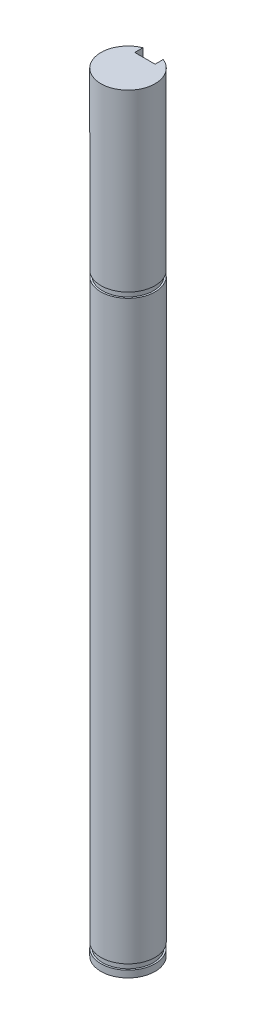
ISO-10303-21;
HEADER;
FILE_DESCRIPTION(('STEP AP214'),'2;1');
FILE_NAME('part.step','',(''),(''),'','','');
FILE_SCHEMA(('AUTOMOTIVE_DESIGN { 1 0 10303 214 1 1 1 1 }'));
ENDSEC;
DATA;
#1=APPLICATION_CONTEXT('core data for automotive mechanical design processes');
#2=APPLICATION_PROTOCOL_DEFINITION('international standard','automotive_design',2000,#1);
#3=PRODUCT_CONTEXT('',#1,'mechanical');
#4=PRODUCT('Part','Part','',(#3));
#5=PRODUCT_RELATED_PRODUCT_CATEGORY('part','',(#4));
#6=PRODUCT_DEFINITION_FORMATION('','',#4);
#7=PRODUCT_DEFINITION_CONTEXT('part definition',#1,'design');
#8=PRODUCT_DEFINITION('design','',#6,#7);
#9=PRODUCT_DEFINITION_SHAPE('','',#8);
#10=(LENGTH_UNIT() NAMED_UNIT(*) SI_UNIT(.MILLI.,.METRE.));
#11=(NAMED_UNIT(*) PLANE_ANGLE_UNIT() SI_UNIT($,.RADIAN.));
#12=(NAMED_UNIT(*) SI_UNIT($,.STERADIAN.) SOLID_ANGLE_UNIT());
#13=UNCERTAINTY_MEASURE_WITH_UNIT(LENGTH_MEASURE(1.E-05),#10,'distance_accuracy_value','');
#14=(GEOMETRIC_REPRESENTATION_CONTEXT(3) GLOBAL_UNCERTAINTY_ASSIGNED_CONTEXT((#13)) GLOBAL_UNIT_ASSIGNED_CONTEXT((#10,
#11,#12)) REPRESENTATION_CONTEXT('',''));
#15=CARTESIAN_POINT('',(0.,0.,0.));
#16=DIRECTION('',(0.,0.,1.));
#17=DIRECTION('',(1.,0.,0.));
#18=AXIS2_PLACEMENT_3D('',#15,#16,#17);
#19=CARTESIAN_POINT('',(0.,111.,0.));
#20=DIRECTION('',(0.,-1.,0.));
#21=DIRECTION('',(0.,0.,-1.));
#22=AXIS2_PLACEMENT_3D('',#19,#20,#21);
#23=CYLINDRICAL_SURFACE('',#22,4.);
#24=CARTESIAN_POINT('',(0.,0.,0.));
#25=DIRECTION('',(0.,1.,0.));
#26=DIRECTION('',(0.,0.,1.));
#27=AXIS2_PLACEMENT_3D('',#24,#25,#26);
#28=CIRCLE('',#27,4.);
#29=CARTESIAN_POINT('',(0.,0.,4.));
#30=VERTEX_POINT('',#29);
#31=EDGE_CURVE('E131',#30,#30,#28,.T.);
#32=ORIENTED_EDGE('',*,*,#31,.T.);
#33=EDGE_LOOP('',(#32));
#34=FACE_BOUND('',#33,.T.);
#35=CARTESIAN_POINT('',(0.,85.2,0.));
#36=DIRECTION('',(0.,1.,0.));
#37=DIRECTION('',(0.,0.,1.));
#38=AXIS2_PLACEMENT_3D('',#35,#36,#37);
#39=CIRCLE('',#38,4.);
#40=CARTESIAN_POINT('',(0.,85.2,4.));
#41=VERTEX_POINT('',#40);
#42=EDGE_CURVE('E127',#41,#41,#39,.T.);
#43=ORIENTED_EDGE('',*,*,#42,.F.);
#44=EDGE_LOOP('',(#43));
#45=FACE_BOUND('',#44,.T.);
#46=ADVANCED_FACE('F44',(#34,#45),#23,.T.);
#47=CARTESIAN_POINT('',(0.,0.,0.));
#48=DIRECTION('',(0.,1.,0.));
#49=DIRECTION('',(0.,0.,1.));
#50=AXIS2_PLACEMENT_3D('',#47,#48,#49);
#51=PLANE('',#50);
#52=CARTESIAN_POINT('',(0.,0.,0.));
#53=DIRECTION('',(0.,1.,0.));
#54=DIRECTION('',(0.,0.,1.));
#55=AXIS2_PLACEMENT_3D('',#52,#53,#54);
#56=CIRCLE('',#55,3.75);
#57=CARTESIAN_POINT('',(0.,0.,3.75));
#58=VERTEX_POINT('',#57);
#59=EDGE_CURVE('E138',#58,#58,#56,.F.);
#60=ORIENTED_EDGE('',*,*,#59,.F.);
#61=EDGE_LOOP('',(#60));
#62=FACE_BOUND('',#61,.T.);
#63=ORIENTED_EDGE('',*,*,#31,.F.);
#64=EDGE_LOOP('',(#63));
#65=FACE_BOUND('',#64,.T.);
#66=ADVANCED_FACE('F144',(#62,#65),#51,.F.);
#67=CARTESIAN_POINT('',(0.,85.2,0.));
#68=DIRECTION('',(0.,1.,0.));
#69=DIRECTION('',(0.,0.,1.));
#70=AXIS2_PLACEMENT_3D('',#67,#68,#69);
#71=CYLINDRICAL_SURFACE('',#70,3.75);
#72=CARTESIAN_POINT('',(0.,85.2,0.));
#73=DIRECTION('',(0.,1.,0.));
#74=DIRECTION('',(0.,0.,1.));
#75=AXIS2_PLACEMENT_3D('',#72,#73,#74);
#76=CIRCLE('',#75,3.75);
#77=CARTESIAN_POINT('',(0.,85.2,3.75));
#78=VERTEX_POINT('',#77);
#79=EDGE_CURVE('E124',#78,#78,#76,.T.);
#80=ORIENTED_EDGE('',*,*,#79,.T.);
#81=EDGE_LOOP('',(#80));
#82=FACE_BOUND('',#81,.T.);
#83=CARTESIAN_POINT('',(0.,86.,0.));
#84=DIRECTION('',(0.,1.,0.));
#85=DIRECTION('',(0.,0.,1.));
#86=AXIS2_PLACEMENT_3D('',#83,#84,#85);
#87=CIRCLE('',#86,3.75);
#88=CARTESIAN_POINT('',(0.,86.,3.75));
#89=VERTEX_POINT('',#88);
#90=EDGE_CURVE('E123',#89,#89,#87,.T.);
#91=ORIENTED_EDGE('',*,*,#90,.F.);
#92=EDGE_LOOP('',(#91));
#93=FACE_BOUND('',#92,.T.);
#94=ADVANCED_FACE('F147',(#82,#93),#71,.T.);
#95=CARTESIAN_POINT('',(0.,85.2,0.));
#96=DIRECTION('',(0.,1.,0.));
#97=DIRECTION('',(0.,0.,1.));
#98=AXIS2_PLACEMENT_3D('',#95,#96,#97);
#99=PLANE('',#98);
#100=ORIENTED_EDGE('',*,*,#79,.F.);
#101=EDGE_LOOP('',(#100));
#102=FACE_BOUND('',#101,.T.);
#103=ORIENTED_EDGE('',*,*,#42,.T.);
#104=EDGE_LOOP('',(#103));
#105=FACE_BOUND('',#104,.T.);
#106=ADVANCED_FACE('F154',(#102,#105),#99,.T.);
#107=CARTESIAN_POINT('',(0.,86.,0.));
#108=DIRECTION('',(0.,1.,0.));
#109=DIRECTION('',(0.,0.,1.));
#110=AXIS2_PLACEMENT_3D('',#107,#108,#109);
#111=PLANE('',#110);
#112=ORIENTED_EDGE('',*,*,#90,.T.);
#113=EDGE_LOOP('',(#112));
#114=FACE_BOUND('',#113,.T.);
#115=CARTESIAN_POINT('',(0.,86.,0.));
#116=DIRECTION('',(0.,1.,0.));
#117=DIRECTION('',(0.,0.,1.));
#118=AXIS2_PLACEMENT_3D('',#115,#116,#117);
#119=CIRCLE('',#118,4.);
#120=CARTESIAN_POINT('',(0.,86.,4.));
#121=VERTEX_POINT('',#120);
#122=EDGE_CURVE('E128',#121,#121,#119,.T.);
#123=ORIENTED_EDGE('',*,*,#122,.F.);
#124=EDGE_LOOP('',(#123));
#125=FACE_BOUND('',#124,.T.);
#126=ADVANCED_FACE('F156',(#114,#125),#111,.F.);
#127=CARTESIAN_POINT('',(0.,111.85,0.));
#128=DIRECTION('',(0.,1.,0.));
#129=DIRECTION('',(0.,0.,1.));
#130=AXIS2_PLACEMENT_3D('',#127,#128,#129);
#131=CIRCLE('',#130,4.);
#132=CARTESIAN_POINT('',(-1.5,111.85,-3.70809924354783));
#133=VERTEX_POINT('',#132);
#134=CARTESIAN_POINT('',(1.5,111.85,-3.70809924354783));
#135=VERTEX_POINT('',#134);
#136=EDGE_CURVE('E120',#133,#135,#131,.T.);
#137=ORIENTED_EDGE('',*,*,#136,.F.);
#138=DIRECTION('',(0.,-1.,0.));
#139=VECTOR('',#138,1.);
#140=CARTESIAN_POINT('',(-1.5,111.,-3.70809924354783));
#141=LINE('',#140,#139);
#142=CARTESIAN_POINT('',(-1.5,91.85,-3.70809924354783));
#143=VERTEX_POINT('',#142);
#144=EDGE_CURVE('E109',#133,#143,#141,.T.);
#145=ORIENTED_EDGE('',*,*,#144,.T.);
#146=CARTESIAN_POINT('',(0.,91.85,0.));
#147=DIRECTION('',(0.,-1.,0.));
#148=DIRECTION('',(0.,0.,-1.));
#149=AXIS2_PLACEMENT_3D('',#146,#147,#148);
#150=CIRCLE('',#149,4.);
#151=CARTESIAN_POINT('',(1.5,91.85,-3.70809924354783));
#152=VERTEX_POINT('',#151);
#153=EDGE_CURVE('E13',#143,#152,#150,.T.);
#154=ORIENTED_EDGE('',*,*,#153,.T.);
#155=DIRECTION('',(0.,-1.,0.));
#156=VECTOR('',#155,1.);
#157=CARTESIAN_POINT('',(1.5,111.,-3.70809924354783));
#158=LINE('',#157,#156);
#159=EDGE_CURVE('E105',#152,#135,#158,.F.);
#160=ORIENTED_EDGE('',*,*,#159,.T.);
#161=EDGE_LOOP('',(#137,#145,#154,#160));
#162=FACE_BOUND('',#161,.T.);
#163=ORIENTED_EDGE('',*,*,#122,.T.);
#164=EDGE_LOOP('',(#163));
#165=FACE_BOUND('',#164,.T.);
#166=ADVANCED_FACE('F46',(#162,#165),#23,.T.);
#167=CARTESIAN_POINT('',(0.,111.85,0.));
#168=DIRECTION('',(0.,1.,0.));
#169=DIRECTION('',(0.,0.,1.));
#170=AXIS2_PLACEMENT_3D('',#167,#168,#169);
#171=PLANE('',#170);
#172=DIRECTION('',(0.,0.,1.));
#173=VECTOR('',#172,1.);
#174=CARTESIAN_POINT('',(-1.5,111.85,0.));
#175=LINE('',#174,#173);
#176=CARTESIAN_POINT('',(-1.5,111.85,-2.5));
#177=VERTEX_POINT('',#176);
#178=EDGE_CURVE('E52',#133,#177,#175,.T.);
#179=ORIENTED_EDGE('',*,*,#178,.F.);
#180=ORIENTED_EDGE('',*,*,#136,.T.);
#181=DIRECTION('',(0.,0.,-1.));
#182=VECTOR('',#181,1.);
#183=CARTESIAN_POINT('',(1.5,111.85,-5.5));
#184=LINE('',#183,#182);
#185=CARTESIAN_POINT('',(1.5,111.85,-2.5));
#186=VERTEX_POINT('',#185);
#187=EDGE_CURVE('E89',#186,#135,#184,.T.);
#188=ORIENTED_EDGE('',*,*,#187,.F.);
#189=DIRECTION('',(1.,0.,0.));
#190=VECTOR('',#189,1.);
#191=CARTESIAN_POINT('',(1.5,111.85,-2.5));
#192=LINE('',#191,#190);
#193=EDGE_CURVE('E102',#177,#186,#192,.T.);
#194=ORIENTED_EDGE('',*,*,#193,.F.);
#195=EDGE_LOOP('',(#179,#180,#188,#194));
#196=FACE_BOUND('',#195,.T.);
#197=ADVANCED_FACE('F169',(#196),#171,.T.);
#198=CARTESIAN_POINT('',(0.,-0.8,0.));
#199=DIRECTION('',(0.,1.,0.));
#200=DIRECTION('',(0.,0.,1.));
#201=AXIS2_PLACEMENT_3D('',#198,#199,#200);
#202=CYLINDRICAL_SURFACE('',#201,3.75);
#203=CARTESIAN_POINT('',(0.,-0.8,0.));
#204=DIRECTION('',(0.,-1.,0.));
#205=DIRECTION('',(0.,0.,-1.));
#206=AXIS2_PLACEMENT_3D('',#203,#204,#205);
#207=CIRCLE('',#206,3.75);
#208=CARTESIAN_POINT('',(0.,-0.8,-3.75));
#209=VERTEX_POINT('',#208);
#210=EDGE_CURVE('E115',#209,#209,#207,.T.);
#211=ORIENTED_EDGE('',*,*,#210,.F.);
#212=EDGE_LOOP('',(#211));
#213=FACE_BOUND('',#212,.T.);
#214=ORIENTED_EDGE('',*,*,#59,.T.);
#215=EDGE_LOOP('',(#214));
#216=FACE_BOUND('',#215,.T.);
#217=ADVANCED_FACE('F142',(#213,#216),#202,.T.);
#218=CARTESIAN_POINT('',(0.,-1.8,0.));
#219=DIRECTION('',(0.,1.,0.));
#220=DIRECTION('',(0.,0.,1.));
#221=AXIS2_PLACEMENT_3D('',#218,#219,#220);
#222=CYLINDRICAL_SURFACE('',#221,4.);
#223=CARTESIAN_POINT('',(0.,-1.8,0.));
#224=DIRECTION('',(0.,-1.,0.));
#225=DIRECTION('',(0.,0.,-1.));
#226=AXIS2_PLACEMENT_3D('',#223,#224,#225);
#227=CIRCLE('',#226,4.);
#228=CARTESIAN_POINT('',(0.,-1.8,-4.));
#229=VERTEX_POINT('',#228);
#230=EDGE_CURVE('E112',#229,#229,#227,.T.);
#231=ORIENTED_EDGE('',*,*,#230,.F.);
#232=EDGE_LOOP('',(#231));
#233=FACE_BOUND('',#232,.T.);
#234=CARTESIAN_POINT('',(0.,-0.8,0.));
#235=DIRECTION('',(0.,-1.,0.));
#236=DIRECTION('',(0.,0.,-1.));
#237=AXIS2_PLACEMENT_3D('',#234,#235,#236);
#238=CIRCLE('',#237,4.);
#239=CARTESIAN_POINT('',(0.,-0.8,-4.));
#240=VERTEX_POINT('',#239);
#241=EDGE_CURVE('E111',#240,#240,#238,.T.);
#242=ORIENTED_EDGE('',*,*,#241,.T.);
#243=EDGE_LOOP('',(#242));
#244=FACE_BOUND('',#243,.T.);
#245=ADVANCED_FACE('F175',(#233,#244),#222,.T.);
#246=CARTESIAN_POINT('',(0.,-1.8,0.));
#247=DIRECTION('',(0.,-1.,0.));
#248=DIRECTION('',(0.,0.,-1.));
#249=AXIS2_PLACEMENT_3D('',#246,#247,#248);
#250=PLANE('',#249);
#251=ORIENTED_EDGE('',*,*,#230,.T.);
#252=EDGE_LOOP('',(#251));
#253=FACE_BOUND('',#252,.T.);
#254=ADVANCED_FACE('F179',(#253),#250,.T.);
#255=CARTESIAN_POINT('',(0.,-0.8,0.));
#256=DIRECTION('',(0.,-1.,0.));
#257=DIRECTION('',(0.,0.,-1.));
#258=AXIS2_PLACEMENT_3D('',#255,#256,#257);
#259=PLANE('',#258);
#260=ORIENTED_EDGE('',*,*,#210,.T.);
#261=EDGE_LOOP('',(#260));
#262=FACE_BOUND('',#261,.T.);
#263=ORIENTED_EDGE('',*,*,#241,.F.);
#264=EDGE_LOOP('',(#263));
#265=FACE_BOUND('',#264,.T.);
#266=ADVANCED_FACE('F181',(#262,#265),#259,.F.);
#267=CARTESIAN_POINT('',(0.,91.85,0.));
#268=DIRECTION('',(0.,-1.,0.));
#269=DIRECTION('',(0.,0.,-1.));
#270=AXIS2_PLACEMENT_3D('',#267,#268,#269);
#271=PLANE('',#270);
#272=DIRECTION('',(0.,0.,1.));
#273=VECTOR('',#272,1.);
#274=CARTESIAN_POINT('',(-1.5,91.85,-5.5));
#275=LINE('',#274,#273);
#276=CARTESIAN_POINT('',(-1.5,91.85,-2.5));
#277=VERTEX_POINT('',#276);
#278=EDGE_CURVE('E84',#143,#277,#275,.T.);
#279=ORIENTED_EDGE('',*,*,#278,.T.);
#280=DIRECTION('',(1.,0.,0.));
#281=VECTOR('',#280,1.);
#282=CARTESIAN_POINT('',(1.5,91.85,-2.5));
#283=LINE('',#282,#281);
#284=CARTESIAN_POINT('',(1.5,91.85,-2.5));
#285=VERTEX_POINT('',#284);
#286=EDGE_CURVE('E86',#277,#285,#283,.T.);
#287=ORIENTED_EDGE('',*,*,#286,.T.);
#288=DIRECTION('',(0.,0.,-1.));
#289=VECTOR('',#288,1.);
#290=CARTESIAN_POINT('',(1.5,91.85,-5.5));
#291=LINE('',#290,#289);
#292=EDGE_CURVE('E95',#285,#152,#291,.T.);
#293=ORIENTED_EDGE('',*,*,#292,.T.);
#294=ORIENTED_EDGE('',*,*,#153,.F.);
#295=EDGE_LOOP('',(#279,#287,#293,#294));
#296=FACE_BOUND('',#295,.T.);
#297=ADVANCED_FACE('F85',(#296),#271,.F.);
#298=CARTESIAN_POINT('',(-1.5,91.85,-5.5));
#299=DIRECTION('',(-1.,0.,0.));
#300=DIRECTION('',(0.,0.,1.));
#301=AXIS2_PLACEMENT_3D('',#298,#299,#300);
#302=PLANE('',#301);
#303=ORIENTED_EDGE('',*,*,#178,.T.);
#304=DIRECTION('',(0.,1.,0.));
#305=VECTOR('',#304,1.);
#306=CARTESIAN_POINT('',(-1.5,91.85,-2.5));
#307=LINE('',#306,#305);
#308=EDGE_CURVE('E59',#277,#177,#307,.T.);
#309=ORIENTED_EDGE('',*,*,#308,.F.);
#310=ORIENTED_EDGE('',*,*,#278,.F.);
#311=ORIENTED_EDGE('',*,*,#144,.F.);
#312=EDGE_LOOP('',(#303,#309,#310,#311));
#313=FACE_BOUND('',#312,.T.);
#314=ADVANCED_FACE('F91',(#313),#302,.F.);
#315=CARTESIAN_POINT('',(1.5,91.85,-5.5));
#316=DIRECTION('',(1.,0.,0.));
#317=DIRECTION('',(0.,0.,-1.));
#318=AXIS2_PLACEMENT_3D('',#315,#316,#317);
#319=PLANE('',#318);
#320=ORIENTED_EDGE('',*,*,#292,.F.);
#321=DIRECTION('',(0.,1.,0.));
#322=VECTOR('',#321,1.);
#323=CARTESIAN_POINT('',(1.5,91.85,-2.5));
#324=LINE('',#323,#322);
#325=EDGE_CURVE('E94',#285,#186,#324,.T.);
#326=ORIENTED_EDGE('',*,*,#325,.T.);
#327=ORIENTED_EDGE('',*,*,#187,.T.);
#328=ORIENTED_EDGE('',*,*,#159,.F.);
#329=EDGE_LOOP('',(#320,#326,#327,#328));
#330=FACE_BOUND('',#329,.T.);
#331=ADVANCED_FACE('F190',(#330),#319,.F.);
#332=CARTESIAN_POINT('',(1.5,91.85,-2.5));
#333=DIRECTION('',(0.,0.,1.));
#334=DIRECTION('',(1.,0.,0.));
#335=AXIS2_PLACEMENT_3D('',#332,#333,#334);
#336=PLANE('',#335);
#337=ORIENTED_EDGE('',*,*,#193,.T.);
#338=ORIENTED_EDGE('',*,*,#325,.F.);
#339=ORIENTED_EDGE('',*,*,#286,.F.);
#340=ORIENTED_EDGE('',*,*,#308,.T.);
#341=EDGE_LOOP('',(#337,#338,#339,#340));
#342=FACE_BOUND('',#341,.T.);
#343=ADVANCED_FACE('F97',(#342),#336,.F.);
#344=CLOSED_SHELL('',(#46,#66,#94,#106,#126,#166,#197,#217,#245,#254,#266,#297,#314,#331,#343));
#345=MANIFOLD_SOLID_BREP('B2',#344);
#346=ADVANCED_BREP_SHAPE_REPRESENTATION('',(#18,#345),#14);
#347=SHAPE_DEFINITION_REPRESENTATION(#9,#346);
ENDSEC;
END-ISO-10303-21;
